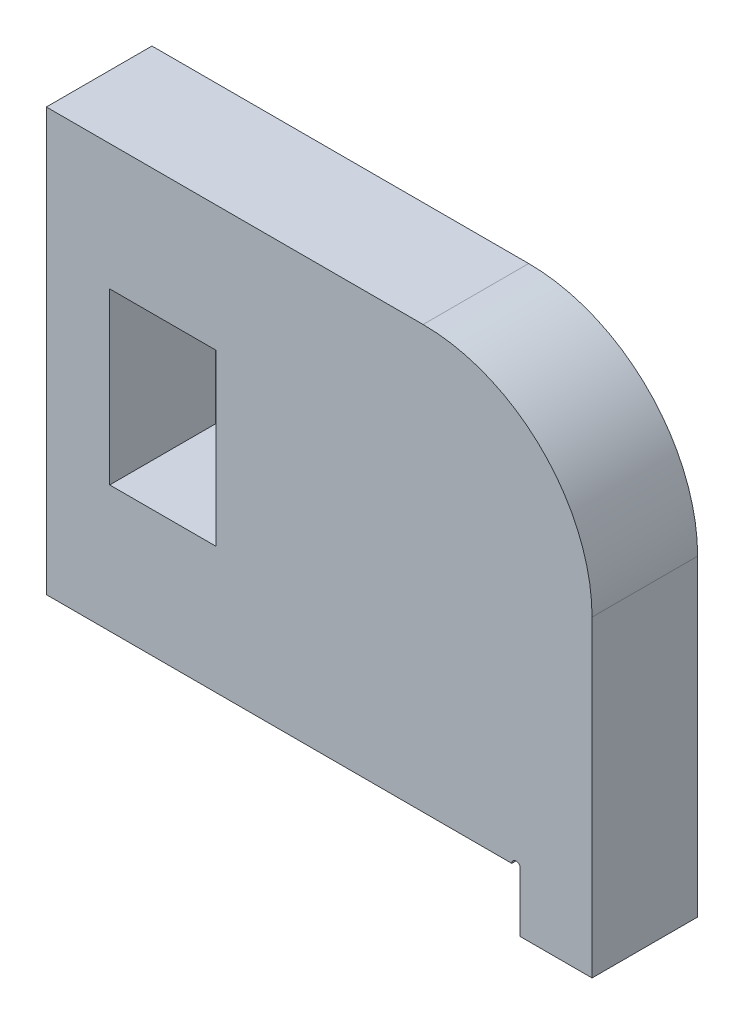
ISO-10303-21;
HEADER;
FILE_DESCRIPTION(('STEP AP214'),'2;1');
FILE_NAME('part.step','',(''),(''),'','','');
FILE_SCHEMA(('AUTOMOTIVE_DESIGN { 1 0 10303 214 1 1 1 1 }'));
ENDSEC;
DATA;
#1=APPLICATION_CONTEXT('core data for automotive mechanical design processes');
#2=APPLICATION_PROTOCOL_DEFINITION('international standard','automotive_design',2000,#1);
#3=PRODUCT_CONTEXT('',#1,'mechanical');
#4=PRODUCT('Part','Part','',(#3));
#5=PRODUCT_RELATED_PRODUCT_CATEGORY('part','',(#4));
#6=PRODUCT_DEFINITION_FORMATION('','',#4);
#7=PRODUCT_DEFINITION_CONTEXT('part definition',#1,'design');
#8=PRODUCT_DEFINITION('design','',#6,#7);
#9=PRODUCT_DEFINITION_SHAPE('','',#8);
#10=(LENGTH_UNIT() NAMED_UNIT(*) SI_UNIT(.MILLI.,.METRE.));
#11=(NAMED_UNIT(*) PLANE_ANGLE_UNIT() SI_UNIT($,.RADIAN.));
#12=(NAMED_UNIT(*) SI_UNIT($,.STERADIAN.) SOLID_ANGLE_UNIT());
#13=UNCERTAINTY_MEASURE_WITH_UNIT(LENGTH_MEASURE(1.E-05),#10,'distance_accuracy_value','');
#14=(GEOMETRIC_REPRESENTATION_CONTEXT(3) GLOBAL_UNCERTAINTY_ASSIGNED_CONTEXT((#13)) GLOBAL_UNIT_ASSIGNED_CONTEXT((#10,
#11,#12)) REPRESENTATION_CONTEXT('',''));
#15=CARTESIAN_POINT('',(0.,0.,0.));
#16=DIRECTION('',(0.,0.,1.));
#17=DIRECTION('',(1.,0.,0.));
#18=AXIS2_PLACEMENT_3D('',#15,#16,#17);
#19=CARTESIAN_POINT('',(0.,0.,0.125));
#20=DIRECTION('',(0.,0.,-1.));
#21=DIRECTION('',(-1.,0.,0.));
#22=AXIS2_PLACEMENT_3D('',#19,#20,#21);
#23=PLANE('',#22);
#24=DIRECTION('',(0.,1.,0.));
#25=VECTOR('',#24,1.);
#26=CARTESIAN_POINT('',(1.292,1.,0.125));
#27=LINE('',#26,#25);
#28=CARTESIAN_POINT('',(1.292,-0.14,0.125));
#29=VERTEX_POINT('',#28);
#30=CARTESIAN_POINT('',(1.292,0.6,0.125));
#31=VERTEX_POINT('',#30);
#32=EDGE_CURVE('E178',#29,#31,#27,.T.);
#33=ORIENTED_EDGE('',*,*,#32,.T.);
#34=CARTESIAN_POINT('',(0.892,0.6,0.125));
#35=DIRECTION('',(0.,0.,-1.));
#36=DIRECTION('',(-1.,0.,0.));
#37=AXIS2_PLACEMENT_3D('',#34,#35,#36);
#38=CIRCLE('',#37,0.4);
#39=CARTESIAN_POINT('',(0.892,1.,0.125));
#40=VERTEX_POINT('',#39);
#41=EDGE_CURVE('E11',#31,#40,#38,.F.);
#42=ORIENTED_EDGE('',*,*,#41,.T.);
#43=DIRECTION('',(-1.,0.,0.));
#44=VECTOR('',#43,1.);
#45=CARTESIAN_POINT('',(0.,1.,0.125));
#46=LINE('',#45,#44);
#47=CARTESIAN_POINT('',(0.,1.,0.125));
#48=VERTEX_POINT('',#47);
#49=EDGE_CURVE('E180',#40,#48,#46,.T.);
#50=ORIENTED_EDGE('',*,*,#49,.T.);
#51=DIRECTION('',(0.,-1.,0.));
#52=VECTOR('',#51,1.);
#53=CARTESIAN_POINT('',(0.,0.,0.125));
#54=LINE('',#53,#52);
#55=CARTESIAN_POINT('',(0.,0.,0.125));
#56=VERTEX_POINT('',#55);
#57=EDGE_CURVE('E182',#48,#56,#54,.T.);
#58=ORIENTED_EDGE('',*,*,#57,.T.);
#59=DIRECTION('',(1.,0.,0.));
#60=VECTOR('',#59,1.);
#61=CARTESIAN_POINT('',(0.302,0.,0.125));
#62=LINE('',#61,#60);
#63=CARTESIAN_POINT('',(1.102,0.,0.125));
#64=VERTEX_POINT('',#63);
#65=EDGE_CURVE('E171',#56,#64,#62,.T.);
#66=ORIENTED_EDGE('',*,*,#65,.T.);
#67=CARTESIAN_POINT('',(1.112,0.,0.125));
#68=DIRECTION('',(0.,0.,-1.));
#69=DIRECTION('',(-1.,0.,0.));
#70=AXIS2_PLACEMENT_3D('',#67,#68,#69);
#71=CIRCLE('',#70,0.01);
#72=CARTESIAN_POINT('',(1.112,0.0100000000000001,0.125));
#73=VERTEX_POINT('',#72);
#74=EDGE_CURVE('E220',#64,#73,#71,.T.);
#75=ORIENTED_EDGE('',*,*,#74,.T.);
#76=CARTESIAN_POINT('',(1.112,0.,0.125));
#77=DIRECTION('',(0.,0.,-1.));
#78=DIRECTION('',(-1.,0.,0.));
#79=AXIS2_PLACEMENT_3D('',#76,#77,#78);
#80=CIRCLE('',#79,0.01);
#81=CARTESIAN_POINT('',(1.122,0.,0.125));
#82=VERTEX_POINT('',#81);
#83=EDGE_CURVE('E216',#73,#82,#80,.T.);
#84=ORIENTED_EDGE('',*,*,#83,.T.);
#85=DIRECTION('',(0.,-1.,0.));
#86=VECTOR('',#85,1.);
#87=CARTESIAN_POINT('',(1.122,-0.14,0.125));
#88=LINE('',#87,#86);
#89=CARTESIAN_POINT('',(1.122,-0.14,0.125));
#90=VERTEX_POINT('',#89);
#91=EDGE_CURVE('E173',#82,#90,#88,.T.);
#92=ORIENTED_EDGE('',*,*,#91,.T.);
#93=DIRECTION('',(1.,0.,0.));
#94=VECTOR('',#93,1.);
#95=CARTESIAN_POINT('',(1.292,-0.14,0.125));
#96=LINE('',#95,#94);
#97=EDGE_CURVE('E176',#90,#29,#96,.T.);
#98=ORIENTED_EDGE('',*,*,#97,.T.);
#99=EDGE_LOOP('',(#33,#42,#50,#58,#66,#75,#84,#92,#98));
#100=FACE_BOUND('',#99,.T.);
#101=DIRECTION('',(0.,-1.,0.));
#102=VECTOR('',#101,1.);
#103=CARTESIAN_POINT('',(0.15,0.702,0.125));
#104=LINE('',#103,#102);
#105=CARTESIAN_POINT('',(0.15,0.702,0.125));
#106=VERTEX_POINT('',#105);
#107=CARTESIAN_POINT('',(0.15,0.3,0.125));
#108=VERTEX_POINT('',#107);
#109=EDGE_CURVE('E129',#106,#108,#104,.T.);
#110=ORIENTED_EDGE('',*,*,#109,.F.);
#111=DIRECTION('',(-1.,0.,0.));
#112=VECTOR('',#111,1.);
#113=CARTESIAN_POINT('',(0.15,0.702,0.125));
#114=LINE('',#113,#112);
#115=CARTESIAN_POINT('',(0.402,0.702,0.125));
#116=VERTEX_POINT('',#115);
#117=EDGE_CURVE('E154',#116,#106,#114,.T.);
#118=ORIENTED_EDGE('',*,*,#117,.F.);
#119=DIRECTION('',(0.,1.,0.));
#120=VECTOR('',#119,1.);
#121=CARTESIAN_POINT('',(0.402,0.702,0.125));
#122=LINE('',#121,#120);
#123=CARTESIAN_POINT('',(0.402,0.3,0.125));
#124=VERTEX_POINT('',#123);
#125=EDGE_CURVE('E152',#124,#116,#122,.T.);
#126=ORIENTED_EDGE('',*,*,#125,.F.);
#127=DIRECTION('',(1.,0.,0.));
#128=VECTOR('',#127,1.);
#129=CARTESIAN_POINT('',(0.15,0.3,0.125));
#130=LINE('',#129,#128);
#131=EDGE_CURVE('E139',#108,#124,#130,.T.);
#132=ORIENTED_EDGE('',*,*,#131,.F.);
#133=EDGE_LOOP('',(#110,#118,#126,#132));
#134=FACE_BOUND('',#133,.T.);
#135=ADVANCED_FACE('F33',(#100,#134),#23,.F.);
#136=CARTESIAN_POINT('',(0.,0.,-0.125));
#137=DIRECTION('',(0.,0.,-1.));
#138=DIRECTION('',(-1.,0.,0.));
#139=AXIS2_PLACEMENT_3D('',#136,#137,#138);
#140=PLANE('',#139);
#141=DIRECTION('',(-1.,0.,0.));
#142=VECTOR('',#141,1.);
#143=CARTESIAN_POINT('',(0.,1.,-0.125));
#144=LINE('',#143,#142);
#145=CARTESIAN_POINT('',(0.892,1.,-0.125));
#146=VERTEX_POINT('',#145);
#147=CARTESIAN_POINT('',(0.,1.,-0.125));
#148=VERTEX_POINT('',#147);
#149=EDGE_CURVE('E193',#146,#148,#144,.T.);
#150=ORIENTED_EDGE('',*,*,#149,.F.);
#151=CARTESIAN_POINT('',(0.892,0.6,-0.125));
#152=DIRECTION('',(0.,0.,-1.));
#153=DIRECTION('',(-1.,0.,0.));
#154=AXIS2_PLACEMENT_3D('',#151,#152,#153);
#155=CIRCLE('',#154,0.4);
#156=CARTESIAN_POINT('',(1.292,0.6,-0.125));
#157=VERTEX_POINT('',#156);
#158=EDGE_CURVE('E55',#146,#157,#155,.T.);
#159=ORIENTED_EDGE('',*,*,#158,.T.);
#160=DIRECTION('',(0.,1.,0.));
#161=VECTOR('',#160,1.);
#162=CARTESIAN_POINT('',(1.292,1.,-0.125));
#163=LINE('',#162,#161);
#164=CARTESIAN_POINT('',(1.292,-0.14,-0.125));
#165=VERTEX_POINT('',#164);
#166=EDGE_CURVE('E191',#165,#157,#163,.T.);
#167=ORIENTED_EDGE('',*,*,#166,.F.);
#168=DIRECTION('',(1.,0.,0.));
#169=VECTOR('',#168,1.);
#170=CARTESIAN_POINT('',(1.292,-0.14,-0.125));
#171=LINE('',#170,#169);
#172=CARTESIAN_POINT('',(1.122,-0.14,-0.125));
#173=VERTEX_POINT('',#172);
#174=EDGE_CURVE('E189',#173,#165,#171,.T.);
#175=ORIENTED_EDGE('',*,*,#174,.F.);
#176=DIRECTION('',(0.,-1.,0.));
#177=VECTOR('',#176,1.);
#178=CARTESIAN_POINT('',(1.122,-0.14,-0.125));
#179=LINE('',#178,#177);
#180=CARTESIAN_POINT('',(1.122,0.,-0.125));
#181=VERTEX_POINT('',#180);
#182=EDGE_CURVE('E187',#181,#173,#179,.T.);
#183=ORIENTED_EDGE('',*,*,#182,.F.);
#184=CARTESIAN_POINT('',(1.112,0.,-0.125));
#185=DIRECTION('',(0.,0.,-1.));
#186=DIRECTION('',(-1.,0.,0.));
#187=AXIS2_PLACEMENT_3D('',#184,#185,#186);
#188=CIRCLE('',#187,0.01);
#189=CARTESIAN_POINT('',(1.112,0.0100000000000001,-0.125));
#190=VERTEX_POINT('',#189);
#191=EDGE_CURVE('E214',#181,#190,#188,.F.);
#192=ORIENTED_EDGE('',*,*,#191,.T.);
#193=CARTESIAN_POINT('',(1.112,0.,-0.125));
#194=DIRECTION('',(0.,0.,-1.));
#195=DIRECTION('',(-1.,0.,0.));
#196=AXIS2_PLACEMENT_3D('',#193,#194,#195);
#197=CIRCLE('',#196,0.01);
#198=CARTESIAN_POINT('',(1.102,0.,-0.125));
#199=VERTEX_POINT('',#198);
#200=EDGE_CURVE('E218',#190,#199,#197,.F.);
#201=ORIENTED_EDGE('',*,*,#200,.T.);
#202=DIRECTION('',(1.,0.,0.));
#203=VECTOR('',#202,1.);
#204=CARTESIAN_POINT('',(1.102,0.,-0.125));
#205=LINE('',#204,#203);
#206=CARTESIAN_POINT('',(0.,0.,-0.125));
#207=VERTEX_POINT('',#206);
#208=EDGE_CURVE('E147',#207,#199,#205,.T.);
#209=ORIENTED_EDGE('',*,*,#208,.F.);
#210=DIRECTION('',(0.,-1.,0.));
#211=VECTOR('',#210,1.);
#212=CARTESIAN_POINT('',(0.,0.,-0.125));
#213=LINE('',#212,#211);
#214=EDGE_CURVE('E174',#148,#207,#213,.T.);
#215=ORIENTED_EDGE('',*,*,#214,.F.);
#216=EDGE_LOOP('',(#150,#159,#167,#175,#183,#192,#201,#209,#215));
#217=FACE_BOUND('',#216,.T.);
#218=DIRECTION('',(-1.,0.,0.));
#219=VECTOR('',#218,1.);
#220=CARTESIAN_POINT('',(0.15,0.702,-0.125));
#221=LINE('',#220,#219);
#222=CARTESIAN_POINT('',(0.402,0.702,-0.125));
#223=VERTEX_POINT('',#222);
#224=CARTESIAN_POINT('',(0.15,0.702,-0.125));
#225=VERTEX_POINT('',#224);
#226=EDGE_CURVE('E140',#223,#225,#221,.T.);
#227=ORIENTED_EDGE('',*,*,#226,.T.);
#228=DIRECTION('',(0.,-1.,0.));
#229=VECTOR('',#228,1.);
#230=CARTESIAN_POINT('',(0.15,0.702,-0.125));
#231=LINE('',#230,#229);
#232=CARTESIAN_POINT('',(0.15,0.3,-0.125));
#233=VERTEX_POINT('',#232);
#234=EDGE_CURVE('E158',#225,#233,#231,.T.);
#235=ORIENTED_EDGE('',*,*,#234,.T.);
#236=DIRECTION('',(1.,0.,0.));
#237=VECTOR('',#236,1.);
#238=CARTESIAN_POINT('',(0.15,0.3,-0.125));
#239=LINE('',#238,#237);
#240=CARTESIAN_POINT('',(0.402,0.3,-0.125));
#241=VERTEX_POINT('',#240);
#242=EDGE_CURVE('E146',#233,#241,#239,.T.);
#243=ORIENTED_EDGE('',*,*,#242,.T.);
#244=DIRECTION('',(0.,1.,0.));
#245=VECTOR('',#244,1.);
#246=CARTESIAN_POINT('',(0.402,0.702,-0.125));
#247=LINE('',#246,#245);
#248=EDGE_CURVE('E162',#241,#223,#247,.T.);
#249=ORIENTED_EDGE('',*,*,#248,.T.);
#250=EDGE_LOOP('',(#227,#235,#243,#249));
#251=FACE_BOUND('',#250,.T.);
#252=ADVANCED_FACE('F235',(#217,#251),#140,.T.);
#253=CARTESIAN_POINT('',(1.102,0.,0.125));
#254=DIRECTION('',(0.,1.,0.));
#255=DIRECTION('',(-1.,0.,0.));
#256=AXIS2_PLACEMENT_3D('',#253,#254,#255);
#257=PLANE('',#256);
#258=ORIENTED_EDGE('',*,*,#208,.T.);
#259=DIRECTION('',(0.,0.,-1.));
#260=VECTOR('',#259,1.);
#261=CARTESIAN_POINT('',(1.102,0.,0.125));
#262=LINE('',#261,#260);
#263=EDGE_CURVE('E208',#64,#199,#262,.T.);
#264=ORIENTED_EDGE('',*,*,#263,.F.);
#265=ORIENTED_EDGE('',*,*,#65,.F.);
#266=DIRECTION('',(0.,0.,-1.));
#267=VECTOR('',#266,1.);
#268=CARTESIAN_POINT('',(0.,0.,0.125));
#269=LINE('',#268,#267);
#270=EDGE_CURVE('E184',#56,#207,#269,.T.);
#271=ORIENTED_EDGE('',*,*,#270,.T.);
#272=EDGE_LOOP('',(#258,#264,#265,#271));
#273=FACE_BOUND('',#272,.T.);
#274=ADVANCED_FACE('F243',(#273),#257,.F.);
#275=CARTESIAN_POINT('',(1.122,-0.14,0.125));
#276=DIRECTION('',(1.,0.,0.));
#277=DIRECTION('',(0.,0.,-1.));
#278=AXIS2_PLACEMENT_3D('',#275,#276,#277);
#279=PLANE('',#278);
#280=ORIENTED_EDGE('',*,*,#91,.F.);
#281=DIRECTION('',(0.,0.,-1.));
#282=VECTOR('',#281,1.);
#283=CARTESIAN_POINT('',(1.122,0.,-0.125));
#284=LINE('',#283,#282);
#285=EDGE_CURVE('E211',#82,#181,#284,.T.);
#286=ORIENTED_EDGE('',*,*,#285,.T.);
#287=ORIENTED_EDGE('',*,*,#182,.T.);
#288=DIRECTION('',(0.,0.,-1.));
#289=VECTOR('',#288,1.);
#290=CARTESIAN_POINT('',(1.122,-0.14,0.125));
#291=LINE('',#290,#289);
#292=EDGE_CURVE('E205',#90,#173,#291,.T.);
#293=ORIENTED_EDGE('',*,*,#292,.F.);
#294=EDGE_LOOP('',(#280,#286,#287,#293));
#295=FACE_BOUND('',#294,.T.);
#296=ADVANCED_FACE('F275',(#295),#279,.F.);
#297=CARTESIAN_POINT('',(1.292,-0.14,0.125));
#298=DIRECTION('',(0.,1.,0.));
#299=DIRECTION('',(0.,0.,1.));
#300=AXIS2_PLACEMENT_3D('',#297,#298,#299);
#301=PLANE('',#300);
#302=ORIENTED_EDGE('',*,*,#174,.T.);
#303=DIRECTION('',(0.,0.,-1.));
#304=VECTOR('',#303,1.);
#305=CARTESIAN_POINT('',(1.292,-0.14,0.125));
#306=LINE('',#305,#304);
#307=EDGE_CURVE('E202',#29,#165,#306,.T.);
#308=ORIENTED_EDGE('',*,*,#307,.F.);
#309=ORIENTED_EDGE('',*,*,#97,.F.);
#310=ORIENTED_EDGE('',*,*,#292,.T.);
#311=EDGE_LOOP('',(#302,#308,#309,#310));
#312=FACE_BOUND('',#311,.T.);
#313=ADVANCED_FACE('F272',(#312),#301,.F.);
#314=CARTESIAN_POINT('',(1.292,1.,0.125));
#315=DIRECTION('',(-1.,0.,0.));
#316=DIRECTION('',(0.,-1.,0.));
#317=AXIS2_PLACEMENT_3D('',#314,#315,#316);
#318=PLANE('',#317);
#319=ORIENTED_EDGE('',*,*,#166,.T.);
#320=DIRECTION('',(0.,0.,-1.));
#321=VECTOR('',#320,1.);
#322=CARTESIAN_POINT('',(1.292,0.6,0.125));
#323=LINE('',#322,#321);
#324=EDGE_CURVE('E41',#157,#31,#323,.F.);
#325=ORIENTED_EDGE('',*,*,#324,.T.);
#326=ORIENTED_EDGE('',*,*,#32,.F.);
#327=ORIENTED_EDGE('',*,*,#307,.T.);
#328=EDGE_LOOP('',(#319,#325,#326,#327));
#329=FACE_BOUND('',#328,.T.);
#330=ADVANCED_FACE('F269',(#329),#318,.F.);
#331=CARTESIAN_POINT('',(0.,1.,0.125));
#332=DIRECTION('',(0.,-1.,0.));
#333=DIRECTION('',(0.,0.,-1.));
#334=AXIS2_PLACEMENT_3D('',#331,#332,#333);
#335=PLANE('',#334);
#336=ORIENTED_EDGE('',*,*,#49,.F.);
#337=DIRECTION('',(0.,0.,-1.));
#338=VECTOR('',#337,1.);
#339=CARTESIAN_POINT('',(0.892,1.,0.125));
#340=LINE('',#339,#338);
#341=EDGE_CURVE('E222',#40,#146,#340,.T.);
#342=ORIENTED_EDGE('',*,*,#341,.T.);
#343=ORIENTED_EDGE('',*,*,#149,.T.);
#344=DIRECTION('',(0.,0.,-1.));
#345=VECTOR('',#344,1.);
#346=CARTESIAN_POINT('',(0.,1.,0.125));
#347=LINE('',#346,#345);
#348=EDGE_CURVE('E199',#48,#148,#347,.T.);
#349=ORIENTED_EDGE('',*,*,#348,.F.);
#350=EDGE_LOOP('',(#336,#342,#343,#349));
#351=FACE_BOUND('',#350,.T.);
#352=ADVANCED_FACE('F230',(#351),#335,.F.);
#353=CARTESIAN_POINT('',(0.,0.,0.125));
#354=DIRECTION('',(1.,0.,0.));
#355=DIRECTION('',(0.,0.,-1.));
#356=AXIS2_PLACEMENT_3D('',#353,#354,#355);
#357=PLANE('',#356);
#358=ORIENTED_EDGE('',*,*,#214,.T.);
#359=ORIENTED_EDGE('',*,*,#270,.F.);
#360=ORIENTED_EDGE('',*,*,#57,.F.);
#361=ORIENTED_EDGE('',*,*,#348,.T.);
#362=EDGE_LOOP('',(#358,#359,#360,#361));
#363=FACE_BOUND('',#362,.T.);
#364=ADVANCED_FACE('F239',(#363),#357,.F.);
#365=CARTESIAN_POINT('',(0.15,0.702,0.125));
#366=DIRECTION('',(1.,0.,0.));
#367=DIRECTION('',(0.,1.,0.));
#368=AXIS2_PLACEMENT_3D('',#365,#366,#367);
#369=PLANE('',#368);
#370=ORIENTED_EDGE('',*,*,#234,.F.);
#371=DIRECTION('',(0.,0.,-1.));
#372=VECTOR('',#371,1.);
#373=CARTESIAN_POINT('',(0.15,0.702,0.125));
#374=LINE('',#373,#372);
#375=EDGE_CURVE('E135',#106,#225,#374,.T.);
#376=ORIENTED_EDGE('',*,*,#375,.F.);
#377=ORIENTED_EDGE('',*,*,#109,.T.);
#378=DIRECTION('',(0.,0.,-1.));
#379=VECTOR('',#378,1.);
#380=CARTESIAN_POINT('',(0.15,0.3,0.125));
#381=LINE('',#380,#379);
#382=EDGE_CURVE('E132',#108,#233,#381,.T.);
#383=ORIENTED_EDGE('',*,*,#382,.T.);
#384=EDGE_LOOP('',(#370,#376,#377,#383));
#385=FACE_BOUND('',#384,.T.);
#386=ADVANCED_FACE('F131',(#385),#369,.T.);
#387=CARTESIAN_POINT('',(0.15,0.3,0.125));
#388=DIRECTION('',(0.,1.,0.));
#389=DIRECTION('',(0.,0.,1.));
#390=AXIS2_PLACEMENT_3D('',#387,#388,#389);
#391=PLANE('',#390);
#392=ORIENTED_EDGE('',*,*,#242,.F.);
#393=ORIENTED_EDGE('',*,*,#382,.F.);
#394=ORIENTED_EDGE('',*,*,#131,.T.);
#395=DIRECTION('',(0.,0.,-1.));
#396=VECTOR('',#395,1.);
#397=CARTESIAN_POINT('',(0.402,0.3,0.125));
#398=LINE('',#397,#396);
#399=EDGE_CURVE('E148',#124,#241,#398,.T.);
#400=ORIENTED_EDGE('',*,*,#399,.T.);
#401=EDGE_LOOP('',(#392,#393,#394,#400));
#402=FACE_BOUND('',#401,.T.);
#403=ADVANCED_FACE('F143',(#402),#391,.T.);
#404=CARTESIAN_POINT('',(0.402,0.702,0.125));
#405=DIRECTION('',(-1.,0.,0.));
#406=DIRECTION('',(0.,-1.,0.));
#407=AXIS2_PLACEMENT_3D('',#404,#405,#406);
#408=PLANE('',#407);
#409=ORIENTED_EDGE('',*,*,#248,.F.);
#410=ORIENTED_EDGE('',*,*,#399,.F.);
#411=ORIENTED_EDGE('',*,*,#125,.T.);
#412=DIRECTION('',(0.,0.,-1.));
#413=VECTOR('',#412,1.);
#414=CARTESIAN_POINT('',(0.402,0.702,0.125));
#415=LINE('',#414,#413);
#416=EDGE_CURVE('E168',#116,#223,#415,.T.);
#417=ORIENTED_EDGE('',*,*,#416,.T.);
#418=EDGE_LOOP('',(#409,#410,#411,#417));
#419=FACE_BOUND('',#418,.T.);
#420=ADVANCED_FACE('F287',(#419),#408,.T.);
#421=CARTESIAN_POINT('',(0.15,0.702,0.125));
#422=DIRECTION('',(0.,-1.,0.));
#423=DIRECTION('',(0.,0.,-1.));
#424=AXIS2_PLACEMENT_3D('',#421,#422,#423);
#425=PLANE('',#424);
#426=ORIENTED_EDGE('',*,*,#226,.F.);
#427=ORIENTED_EDGE('',*,*,#416,.F.);
#428=ORIENTED_EDGE('',*,*,#117,.T.);
#429=ORIENTED_EDGE('',*,*,#375,.T.);
#430=EDGE_LOOP('',(#426,#427,#428,#429));
#431=FACE_BOUND('',#430,.T.);
#432=ADVANCED_FACE('F282',(#431),#425,.T.);
#433=CARTESIAN_POINT('',(1.112,0.,0.125));
#434=DIRECTION('',(0.,0.,1.));
#435=DIRECTION('',(1.,0.,0.));
#436=AXIS2_PLACEMENT_3D('',#433,#434,#435);
#437=CYLINDRICAL_SURFACE('',#436,0.01);
#438=DIRECTION('',(0.,0.,-1.));
#439=VECTOR('',#438,1.);
#440=CARTESIAN_POINT('',(1.112,0.0100000000000001,-0.125));
#441=LINE('',#440,#439);
#442=EDGE_CURVE('E160',#73,#190,#441,.T.);
#443=ORIENTED_EDGE('',*,*,#442,.F.);
#444=ORIENTED_EDGE('',*,*,#74,.F.);
#445=ORIENTED_EDGE('',*,*,#263,.T.);
#446=ORIENTED_EDGE('',*,*,#200,.F.);
#447=EDGE_LOOP('',(#443,#444,#445,#446));
#448=FACE_BOUND('',#447,.T.);
#449=ADVANCED_FACE('F253',(#448),#437,.F.);
#450=CARTESIAN_POINT('',(1.112,0.,0.125));
#451=DIRECTION('',(0.,0.,1.));
#452=DIRECTION('',(1.,0.,0.));
#453=AXIS2_PLACEMENT_3D('',#450,#451,#452);
#454=CYLINDRICAL_SURFACE('',#453,0.01);
#455=ORIENTED_EDGE('',*,*,#83,.F.);
#456=ORIENTED_EDGE('',*,*,#442,.T.);
#457=ORIENTED_EDGE('',*,*,#191,.F.);
#458=ORIENTED_EDGE('',*,*,#285,.F.);
#459=EDGE_LOOP('',(#455,#456,#457,#458));
#460=FACE_BOUND('',#459,.T.);
#461=ADVANCED_FACE('F249',(#460),#454,.F.);
#462=CARTESIAN_POINT('',(0.892,0.6,0.125));
#463=DIRECTION('',(0.,0.,-1.));
#464=DIRECTION('',(-1.,0.,0.));
#465=AXIS2_PLACEMENT_3D('',#462,#463,#464);
#466=CYLINDRICAL_SURFACE('',#465,0.4);
#467=ORIENTED_EDGE('',*,*,#41,.F.);
#468=ORIENTED_EDGE('',*,*,#324,.F.);
#469=ORIENTED_EDGE('',*,*,#158,.F.);
#470=ORIENTED_EDGE('',*,*,#341,.F.);
#471=EDGE_LOOP('',(#467,#468,#469,#470));
#472=FACE_BOUND('',#471,.T.);
#473=ADVANCED_FACE('F35',(#472),#466,.T.);
#474=CLOSED_SHELL('',(#135,#252,#274,#296,#313,#330,#352,#364,#386,#403,#420,#432,#449,#461,#473));
#475=MANIFOLD_SOLID_BREP('B2',#474);
#476=ADVANCED_BREP_SHAPE_REPRESENTATION('',(#18,#475),#14);
#477=SHAPE_DEFINITION_REPRESENTATION(#9,#476);
ENDSEC;
END-ISO-10303-21;
